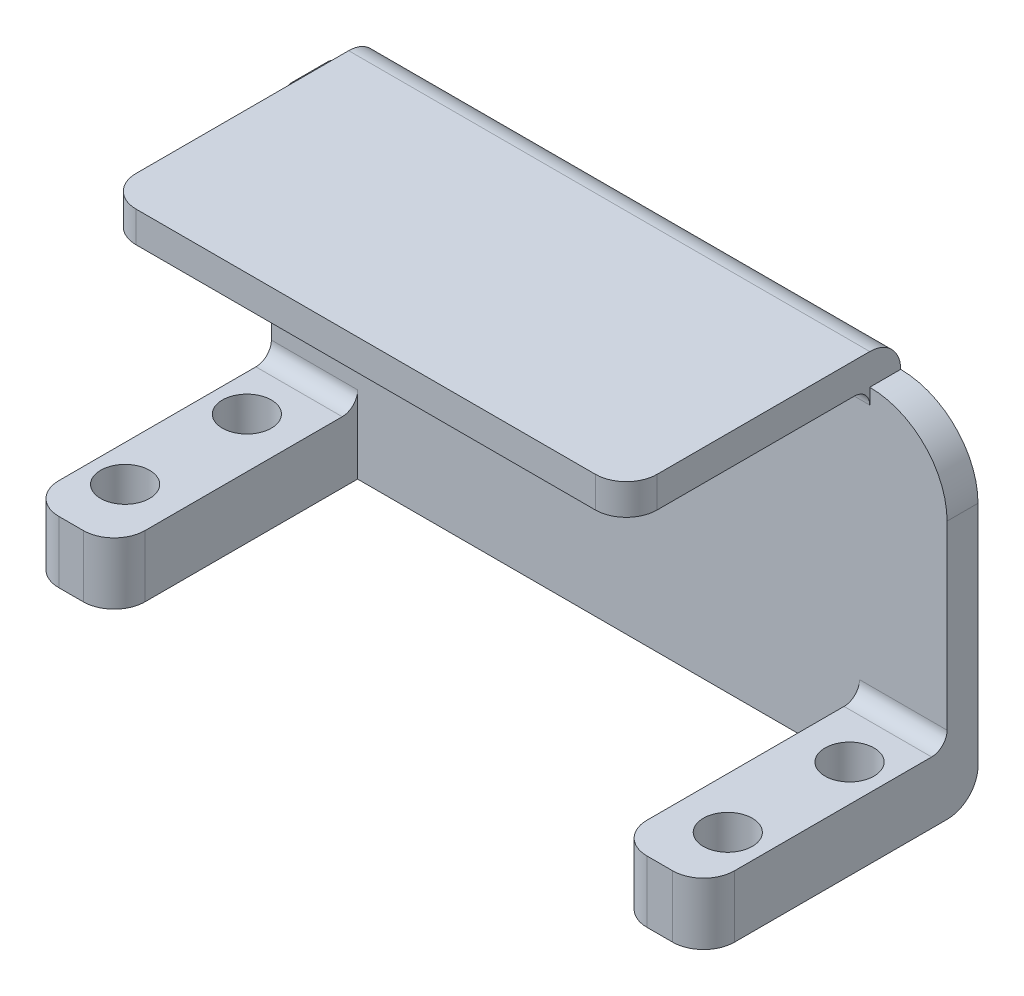
ISO-10303-21;
HEADER;
FILE_DESCRIPTION(('STEP AP214'),'2;1');
FILE_NAME('part.step','',(''),(''),'','','');
FILE_SCHEMA(('AUTOMOTIVE_DESIGN { 1 0 10303 214 1 1 1 1 }'));
ENDSEC;
DATA;
#1=APPLICATION_CONTEXT('core data for automotive mechanical design processes');
#2=APPLICATION_PROTOCOL_DEFINITION('international standard','automotive_design',2000,#1);
#3=PRODUCT_CONTEXT('',#1,'mechanical');
#4=PRODUCT('Part','Part','',(#3));
#5=PRODUCT_RELATED_PRODUCT_CATEGORY('part','',(#4));
#6=PRODUCT_DEFINITION_FORMATION('','',#4);
#7=PRODUCT_DEFINITION_CONTEXT('part definition',#1,'design');
#8=PRODUCT_DEFINITION('design','',#6,#7);
#9=PRODUCT_DEFINITION_SHAPE('','',#8);
#10=(LENGTH_UNIT() NAMED_UNIT(*) SI_UNIT(.MILLI.,.METRE.));
#11=(NAMED_UNIT(*) PLANE_ANGLE_UNIT() SI_UNIT($,.RADIAN.));
#12=(NAMED_UNIT(*) SI_UNIT($,.STERADIAN.) SOLID_ANGLE_UNIT());
#13=UNCERTAINTY_MEASURE_WITH_UNIT(LENGTH_MEASURE(1.E-05),#10,'distance_accuracy_value','');
#14=(GEOMETRIC_REPRESENTATION_CONTEXT(3) GLOBAL_UNCERTAINTY_ASSIGNED_CONTEXT((#13)) GLOBAL_UNIT_ASSIGNED_CONTEXT((#10,
#11,#12)) REPRESENTATION_CONTEXT('',''));
#15=CARTESIAN_POINT('',(0.,0.,0.));
#16=DIRECTION('',(0.,0.,1.));
#17=DIRECTION('',(1.,0.,0.));
#18=AXIS2_PLACEMENT_3D('',#15,#16,#17);
#19=CARTESIAN_POINT('',(0.,0.,0.));
#20=DIRECTION('',(0.,0.,1.));
#21=DIRECTION('',(1.,0.,0.));
#22=AXIS2_PLACEMENT_3D('',#19,#20,#21);
#23=PLANE('',#22);
#24=DIRECTION('',(0.,-1.,0.));
#25=VECTOR('',#24,1.);
#26=CARTESIAN_POINT('',(18.0906530612245,0.,0.));
#27=LINE('',#26,#25);
#28=CARTESIAN_POINT('',(18.0906530612245,-6.66374149659865,0.));
#29=VERTEX_POINT('',#28);
#30=CARTESIAN_POINT('',(18.0906530612245,-13.0137414965986,0.));
#31=VERTEX_POINT('',#30);
#32=EDGE_CURVE('E388',#29,#31,#27,.T.);
#33=ORIENTED_EDGE('',*,*,#32,.F.);
#34=DIRECTION('',(-1.,0.,0.));
#35=VECTOR('',#34,1.);
#36=CARTESIAN_POINT('',(0.,-6.66374149659866,0.));
#37=LINE('',#36,#35);
#38=CARTESIAN_POINT('',(25.2826530612245,-6.66374149659865,0.));
#39=VERTEX_POINT('',#38);
#40=EDGE_CURVE('E350',#29,#39,#37,.F.);
#41=ORIENTED_EDGE('',*,*,#40,.T.);
#42=DIRECTION('',(0.,1.,0.));
#43=VECTOR('',#42,1.);
#44=CARTESIAN_POINT('',(25.2826530612245,0.,0.));
#45=LINE('',#44,#43);
#46=CARTESIAN_POINT('',(25.2826530612245,8.20625850340137,0.));
#47=VERTEX_POINT('',#46);
#48=EDGE_CURVE('E252',#39,#47,#45,.T.);
#49=ORIENTED_EDGE('',*,*,#48,.T.);
#50=CARTESIAN_POINT('',(18.9326530612245,8.20625850340137,0.));
#51=DIRECTION('',(0.,0.,1.));
#52=DIRECTION('',(1.,0.,0.));
#53=AXIS2_PLACEMENT_3D('',#50,#51,#52);
#54=CIRCLE('',#53,6.35);
#55=CARTESIAN_POINT('',(18.9326530612245,14.5562585034014,0.));
#56=VERTEX_POINT('',#55);
#57=EDGE_CURVE('E254',#47,#56,#54,.T.);
#58=ORIENTED_EDGE('',*,*,#57,.T.);
#59=DIRECTION('',(0.,-1.,0.));
#60=VECTOR('',#59,1.);
#61=CARTESIAN_POINT('',(18.9326530612245,0.,0.));
#62=LINE('',#61,#60);
#63=CARTESIAN_POINT('',(18.9326530612245,13.2862585034014,0.));
#64=VERTEX_POINT('',#63);
#65=EDGE_CURVE('E56',#56,#64,#62,.T.);
#66=ORIENTED_EDGE('',*,*,#65,.T.);
#67=DIRECTION('',(1.,0.,0.));
#68=VECTOR('',#67,1.);
#69=CARTESIAN_POINT('',(0.,13.2862585034014,0.));
#70=LINE('',#69,#68);
#71=CARTESIAN_POINT('',(-23.8673469387755,13.2862585034014,0.));
#72=VERTEX_POINT('',#71);
#73=EDGE_CURVE('E220',#64,#72,#70,.F.);
#74=ORIENTED_EDGE('',*,*,#73,.T.);
#75=DIRECTION('',(0.,1.,0.));
#76=VECTOR('',#75,1.);
#77=CARTESIAN_POINT('',(-23.8673469387755,0.,0.));
#78=LINE('',#77,#76);
#79=CARTESIAN_POINT('',(-23.8673469387755,14.5562585034014,0.));
#80=VERTEX_POINT('',#79);
#81=EDGE_CURVE('E214',#72,#80,#78,.T.);
#82=ORIENTED_EDGE('',*,*,#81,.T.);
#83=CARTESIAN_POINT('',(-23.8673469387755,8.20625850340136,0.));
#84=DIRECTION('',(0.,0.,1.));
#85=DIRECTION('',(1.,0.,0.));
#86=AXIS2_PLACEMENT_3D('',#83,#84,#85);
#87=CIRCLE('',#86,6.35);
#88=CARTESIAN_POINT('',(-30.2173469387755,8.20625850340136,0.));
#89=VERTEX_POINT('',#88);
#90=EDGE_CURVE('E218',#80,#89,#87,.T.);
#91=ORIENTED_EDGE('',*,*,#90,.T.);
#92=DIRECTION('',(0.,1.,0.));
#93=VECTOR('',#92,1.);
#94=CARTESIAN_POINT('',(-30.2173469387755,0.,0.));
#95=LINE('',#94,#93);
#96=CARTESIAN_POINT('',(-30.2173469387755,-6.66374149659866,0.));
#97=VERTEX_POINT('',#96);
#98=EDGE_CURVE('E238',#97,#89,#95,.T.);
#99=ORIENTED_EDGE('',*,*,#98,.F.);
#100=DIRECTION('',(1.,0.,0.));
#101=VECTOR('',#100,1.);
#102=CARTESIAN_POINT('',(-23.1253469387755,-6.66374149659866,0.));
#103=LINE('',#102,#101);
#104=CARTESIAN_POINT('',(-23.1253469387755,-6.66374149659866,0.));
#105=VERTEX_POINT('',#104);
#106=EDGE_CURVE('E347',#97,#105,#103,.T.);
#107=ORIENTED_EDGE('',*,*,#106,.T.);
#108=DIRECTION('',(0.,-1.,0.));
#109=VECTOR('',#108,1.);
#110=CARTESIAN_POINT('',(-23.1253469387755,0.,0.));
#111=LINE('',#110,#109);
#112=CARTESIAN_POINT('',(-23.1253469387755,-13.0037414965987,0.));
#113=VERTEX_POINT('',#112);
#114=EDGE_CURVE('E418',#105,#113,#111,.T.);
#115=ORIENTED_EDGE('',*,*,#114,.T.);
#116=DIRECTION('',(-0.999999005895813,-0.00141003807937902,0.));
#117=VECTOR('',#116,1.);
#118=CARTESIAN_POINT('',(0.0182897744713675,-12.9711080550966,0.));
#119=LINE('',#118,#117);
#120=CARTESIAN_POINT('',(-30.2173469387755,-13.0137414965987,0.));
#121=VERTEX_POINT('',#120);
#122=EDGE_CURVE('E403',#113,#121,#119,.T.);
#123=ORIENTED_EDGE('',*,*,#122,.T.);
#124=DIRECTION('',(-1.,0.,0.));
#125=VECTOR('',#124,1.);
#126=CARTESIAN_POINT('',(0.,-13.0137414965987,0.));
#127=LINE('',#126,#125);
#128=EDGE_CURVE('E241',#31,#121,#127,.T.);
#129=ORIENTED_EDGE('',*,*,#128,.F.);
#130=EDGE_LOOP('',(#33,#41,#49,#58,#66,#74,#82,#91,#99,#107,#115,#123,#129));
#131=FACE_BOUND('',#130,.T.);
#132=ADVANCED_FACE('F39',(#131),#23,.T.);
#133=CARTESIAN_POINT('',(18.9326530612245,0.,-2.54));
#134=DIRECTION('',(-1.,0.,0.));
#135=DIRECTION('',(0.,0.,1.));
#136=AXIS2_PLACEMENT_3D('',#133,#134,#135);
#137=PLANE('',#136);
#138=DIRECTION('',(0.,0.,1.));
#139=VECTOR('',#138,1.);
#140=CARTESIAN_POINT('',(18.9326530612245,14.5562585034014,-2.54));
#141=LINE('',#140,#139);
#142=CARTESIAN_POINT('',(18.9326530612245,14.5562585034014,-2.54));
#143=VERTEX_POINT('',#142);
#144=EDGE_CURVE('E257',#143,#56,#141,.T.);
#145=ORIENTED_EDGE('',*,*,#144,.F.);
#146=CARTESIAN_POINT('',(18.9326530612245,14.5562585034014,0.));
#147=DIRECTION('',(-1.,0.,0.));
#148=DIRECTION('',(0.,0.,1.));
#149=AXIS2_PLACEMENT_3D('',#146,#147,#148);
#150=CIRCLE('',#149,2.54);
#151=CARTESIAN_POINT('',(18.9326530612245,17.0962585034014,0.));
#152=VERTEX_POINT('',#151);
#153=EDGE_CURVE('E281',#143,#152,#150,.F.);
#154=ORIENTED_EDGE('',*,*,#153,.T.);
#155=DIRECTION('',(0.,0.,1.));
#156=VECTOR('',#155,1.);
#157=CARTESIAN_POINT('',(18.9326530612245,17.0962585034014,-2.54));
#158=LINE('',#157,#156);
#159=CARTESIAN_POINT('',(18.9326530612245,17.0962585034014,17.46));
#160=VERTEX_POINT('',#159);
#161=EDGE_CURVE('E270',#152,#160,#158,.T.);
#162=ORIENTED_EDGE('',*,*,#161,.T.);
#163=DIRECTION('',(0.,-1.,0.));
#164=VECTOR('',#163,1.);
#165=CARTESIAN_POINT('',(18.9326530612245,0.,17.46));
#166=LINE('',#165,#164);
#167=CARTESIAN_POINT('',(18.9326530612245,14.5562585034014,17.46));
#168=VERTEX_POINT('',#167);
#169=EDGE_CURVE('E278',#160,#168,#166,.T.);
#170=ORIENTED_EDGE('',*,*,#169,.T.);
#171=DIRECTION('',(0.,0.,-1.));
#172=VECTOR('',#171,1.);
#173=CARTESIAN_POINT('',(18.9326530612245,14.5562585034014,62.8753029143819));
#174=LINE('',#173,#172);
#175=CARTESIAN_POINT('',(18.9326530612245,14.5562585034014,1.27));
#176=VERTEX_POINT('',#175);
#177=EDGE_CURVE('E372',#168,#176,#174,.T.);
#178=ORIENTED_EDGE('',*,*,#177,.T.);
#179=CARTESIAN_POINT('',(18.9326530612245,13.2862585034014,1.27));
#180=DIRECTION('',(-1.,0.,0.));
#181=DIRECTION('',(0.,0.,1.));
#182=AXIS2_PLACEMENT_3D('',#179,#180,#181);
#183=CIRCLE('',#182,1.27);
#184=EDGE_CURVE('E48',#176,#64,#183,.T.);
#185=ORIENTED_EDGE('',*,*,#184,.T.);
#186=ORIENTED_EDGE('',*,*,#65,.F.);
#187=EDGE_LOOP('',(#145,#154,#162,#170,#178,#185,#186));
#188=FACE_BOUND('',#187,.T.);
#189=ADVANCED_FACE('F447',(#188),#137,.F.);
#190=CARTESIAN_POINT('',(18.9326530612245,8.20625850340137,-2.54));
#191=DIRECTION('',(0.,0.,1.));
#192=DIRECTION('',(1.,0.,0.));
#193=AXIS2_PLACEMENT_3D('',#190,#191,#192);
#194=CYLINDRICAL_SURFACE('',#193,6.35);
#195=ORIENTED_EDGE('',*,*,#57,.F.);
#196=DIRECTION('',(0.,0.,1.));
#197=VECTOR('',#196,1.);
#198=CARTESIAN_POINT('',(25.2826530612245,8.20625850340137,-2.54));
#199=LINE('',#198,#197);
#200=CARTESIAN_POINT('',(25.2826530612245,8.20625850340137,-2.54));
#201=VERTEX_POINT('',#200);
#202=EDGE_CURVE('E261',#201,#47,#199,.T.);
#203=ORIENTED_EDGE('',*,*,#202,.F.);
#204=CARTESIAN_POINT('',(18.9326530612245,8.20625850340137,-2.54));
#205=DIRECTION('',(0.,0.,1.));
#206=DIRECTION('',(1.,0.,0.));
#207=AXIS2_PLACEMENT_3D('',#204,#205,#206);
#208=CIRCLE('',#207,6.35);
#209=EDGE_CURVE('E247',#201,#143,#208,.T.);
#210=ORIENTED_EDGE('',*,*,#209,.T.);
#211=ORIENTED_EDGE('',*,*,#144,.T.);
#212=EDGE_LOOP('',(#195,#203,#210,#211));
#213=FACE_BOUND('',#212,.T.);
#214=ADVANCED_FACE('F441',(#213),#194,.T.);
#215=CARTESIAN_POINT('',(25.2826530612245,0.,-2.54));
#216=DIRECTION('',(1.,0.,0.));
#217=DIRECTION('',(0.,1.,0.));
#218=AXIS2_PLACEMENT_3D('',#215,#216,#217);
#219=PLANE('',#218);
#220=DIRECTION('',(0.,0.,1.));
#221=VECTOR('',#220,1.);
#222=CARTESIAN_POINT('',(25.2826530612245,-13.0137414965986,-2.54));
#223=LINE('',#222,#221);
#224=CARTESIAN_POINT('',(25.2826530612245,-13.0137414965986,0.));
#225=VERTEX_POINT('',#224);
#226=CARTESIAN_POINT('',(25.2826530612245,-13.0137414965986,17.46));
#227=VERTEX_POINT('',#226);
#228=EDGE_CURVE('E264',#225,#227,#223,.T.);
#229=ORIENTED_EDGE('',*,*,#228,.F.);
#230=CARTESIAN_POINT('',(25.2826530612245,-10.4737414965986,0.));
#231=DIRECTION('',(1.,0.,0.));
#232=DIRECTION('',(0.,1.,0.));
#233=AXIS2_PLACEMENT_3D('',#230,#231,#232);
#234=CIRCLE('',#233,2.54);
#235=CARTESIAN_POINT('',(25.2826530612245,-10.4737414965986,-2.54));
#236=VERTEX_POINT('',#235);
#237=EDGE_CURVE('E315',#225,#236,#234,.T.);
#238=ORIENTED_EDGE('',*,*,#237,.T.);
#239=DIRECTION('',(0.,1.,0.));
#240=VECTOR('',#239,1.);
#241=CARTESIAN_POINT('',(25.2826530612245,0.,-2.54));
#242=LINE('',#241,#240);
#243=EDGE_CURVE('E433',#236,#201,#242,.T.);
#244=ORIENTED_EDGE('',*,*,#243,.T.);
#245=ORIENTED_EDGE('',*,*,#202,.T.);
#246=ORIENTED_EDGE('',*,*,#48,.F.);
#247=CARTESIAN_POINT('',(25.2826530612245,-6.66374149659865,1.27));
#248=DIRECTION('',(1.,0.,0.));
#249=DIRECTION('',(0.,1.,0.));
#250=AXIS2_PLACEMENT_3D('',#247,#248,#249);
#251=CIRCLE('',#250,1.27);
#252=CARTESIAN_POINT('',(25.2826530612245,-7.93374149659865,1.27));
#253=VERTEX_POINT('',#252);
#254=EDGE_CURVE('E360',#39,#253,#251,.F.);
#255=ORIENTED_EDGE('',*,*,#254,.T.);
#256=DIRECTION('',(0.,0.,-1.));
#257=VECTOR('',#256,1.);
#258=CARTESIAN_POINT('',(25.2826530612245,-7.93374149659865,62.8753029143819));
#259=LINE('',#258,#257);
#260=CARTESIAN_POINT('',(25.2826530612245,-7.93374149659865,17.46));
#261=VERTEX_POINT('',#260);
#262=EDGE_CURVE('E406',#261,#253,#259,.T.);
#263=ORIENTED_EDGE('',*,*,#262,.F.);
#264=DIRECTION('',(0.,-1.,0.));
#265=VECTOR('',#264,1.);
#266=CARTESIAN_POINT('',(25.2826530612245,-13.0137414965986,17.46));
#267=LINE('',#266,#265);
#268=EDGE_CURVE('E312',#261,#227,#267,.T.);
#269=ORIENTED_EDGE('',*,*,#268,.T.);
#270=EDGE_LOOP('',(#229,#238,#244,#245,#246,#255,#263,#269));
#271=FACE_BOUND('',#270,.T.);
#272=ADVANCED_FACE('F480',(#271),#219,.T.);
#273=CARTESIAN_POINT('',(0.,-13.0137414965987,-2.54));
#274=DIRECTION('',(0.,1.,0.));
#275=DIRECTION('',(-1.,0.,0.));
#276=AXIS2_PLACEMENT_3D('',#273,#274,#275);
#277=PLANE('',#276);
#278=CARTESIAN_POINT('',(22.278437043176,-13.0137414965986,15.));
#279=DIRECTION('',(0.,1.,0.));
#280=DIRECTION('',(-1.,0.,0.));
#281=AXIS2_PLACEMENT_3D('',#278,#279,#280);
#282=ELLIPSE('',#281,2.0100019981514,2.01);
#283=CARTESIAN_POINT('',(20.2684350450246,-13.0137414965986,15.));
#284=VERTEX_POINT('',#283);
#285=EDGE_CURVE('E617',#284,#284,#282,.T.);
#286=ORIENTED_EDGE('',*,*,#285,.T.);
#287=EDGE_LOOP('',(#286));
#288=FACE_BOUND('',#287,.T.);
#289=CARTESIAN_POINT('',(22.278437043176,-13.0137414965986,5.));
#290=DIRECTION('',(0.,1.,0.));
#291=DIRECTION('',(-1.,0.,0.));
#292=AXIS2_PLACEMENT_3D('',#289,#290,#291);
#293=ELLIPSE('',#292,2.01000199815141,2.01);
#294=CARTESIAN_POINT('',(20.2684350450246,-13.0137414965986,5.));
#295=VERTEX_POINT('',#294);
#296=EDGE_CURVE('E374',#295,#295,#293,.T.);
#297=ORIENTED_EDGE('',*,*,#296,.T.);
#298=EDGE_LOOP('',(#297));
#299=FACE_BOUND('',#298,.T.);
#300=DIRECTION('',(0.,0.,-1.));
#301=VECTOR('',#300,1.);
#302=CARTESIAN_POINT('',(18.0906530612245,-13.0137414965986,62.8753029143819));
#303=LINE('',#302,#301);
#304=CARTESIAN_POINT('',(18.0906530612245,-13.0137414965986,17.46));
#305=VERTEX_POINT('',#304);
#306=EDGE_CURVE('E409',#305,#31,#303,.T.);
#307=ORIENTED_EDGE('',*,*,#306,.T.);
#308=DIRECTION('',(-1.,0.,0.));
#309=VECTOR('',#308,1.);
#310=CARTESIAN_POINT('',(0.,-13.0137414965987,0.));
#311=LINE('',#310,#309);
#312=EDGE_CURVE('E310',#31,#225,#311,.F.);
#313=ORIENTED_EDGE('',*,*,#312,.T.);
#314=ORIENTED_EDGE('',*,*,#228,.T.);
#315=CARTESIAN_POINT('',(22.7426530612245,-13.0137414965986,17.46));
#316=DIRECTION('',(0.,1.,0.));
#317=DIRECTION('',(-1.,0.,0.));
#318=AXIS2_PLACEMENT_3D('',#315,#316,#317);
#319=CIRCLE('',#318,2.54);
#320=CARTESIAN_POINT('',(22.7426530612245,-13.0137414965986,20.));
#321=VERTEX_POINT('',#320);
#322=EDGE_CURVE('E306',#227,#321,#319,.F.);
#323=ORIENTED_EDGE('',*,*,#322,.T.);
#324=DIRECTION('',(-1.,0.,0.));
#325=VECTOR('',#324,1.);
#326=CARTESIAN_POINT('',(0.,-13.0137414965987,20.));
#327=LINE('',#326,#325);
#328=CARTESIAN_POINT('',(20.6306530612245,-13.0137414965986,20.));
#329=VERTEX_POINT('',#328);
#330=EDGE_CURVE('E396',#321,#329,#327,.T.);
#331=ORIENTED_EDGE('',*,*,#330,.T.);
#332=CARTESIAN_POINT('',(20.6306530612245,-13.0137414965986,17.46));
#333=DIRECTION('',(0.,1.,0.));
#334=DIRECTION('',(-1.,0.,0.));
#335=AXIS2_PLACEMENT_3D('',#332,#333,#334);
#336=CIRCLE('',#335,2.54);
#337=EDGE_CURVE('E308',#329,#305,#336,.F.);
#338=ORIENTED_EDGE('',*,*,#337,.T.);
#339=EDGE_LOOP('',(#307,#313,#314,#323,#331,#338));
#340=FACE_BOUND('',#339,.T.);
#341=ADVANCED_FACE('F483',(#288,#299,#340),#277,.F.);
#342=CARTESIAN_POINT('',(-30.2173469387755,0.,-2.54));
#343=DIRECTION('',(1.,0.,0.));
#344=DIRECTION('',(0.,1.,0.));
#345=AXIS2_PLACEMENT_3D('',#342,#343,#344);
#346=PLANE('',#345);
#347=DIRECTION('',(0.,1.,0.));
#348=VECTOR('',#347,1.);
#349=CARTESIAN_POINT('',(-30.2173469387755,0.,-2.54));
#350=LINE('',#349,#348);
#351=CARTESIAN_POINT('',(-30.2173469387755,-10.4737414965987,-2.54));
#352=VERTEX_POINT('',#351);
#353=CARTESIAN_POINT('',(-30.2173469387755,8.20625850340136,-2.54));
#354=VERTEX_POINT('',#353);
#355=EDGE_CURVE('E432',#352,#354,#350,.T.);
#356=ORIENTED_EDGE('',*,*,#355,.F.);
#357=CARTESIAN_POINT('',(-30.2173469387755,-10.4737414965987,0.));
#358=DIRECTION('',(1.,0.,0.));
#359=DIRECTION('',(0.,1.,0.));
#360=AXIS2_PLACEMENT_3D('',#357,#358,#359);
#361=CIRCLE('',#360,2.54);
#362=EDGE_CURVE('E304',#352,#121,#361,.F.);
#363=ORIENTED_EDGE('',*,*,#362,.T.);
#364=DIRECTION('',(0.,0.,-1.));
#365=VECTOR('',#364,1.);
#366=CARTESIAN_POINT('',(-30.2173469387755,-13.0137414965987,62.8753029143819));
#367=LINE('',#366,#365);
#368=CARTESIAN_POINT('',(-30.2173469387755,-13.0137414965987,17.46));
#369=VERTEX_POINT('',#368);
#370=EDGE_CURVE('E421',#369,#121,#367,.T.);
#371=ORIENTED_EDGE('',*,*,#370,.F.);
#372=DIRECTION('',(0.,1.,0.));
#373=VECTOR('',#372,1.);
#374=CARTESIAN_POINT('',(-30.2173469387755,0.,17.46));
#375=LINE('',#374,#373);
#376=CARTESIAN_POINT('',(-30.2173469387755,-7.93374149659866,17.46));
#377=VERTEX_POINT('',#376);
#378=EDGE_CURVE('E301',#369,#377,#375,.T.);
#379=ORIENTED_EDGE('',*,*,#378,.T.);
#380=DIRECTION('',(0.,0.,-1.));
#381=VECTOR('',#380,1.);
#382=CARTESIAN_POINT('',(-30.2173469387755,-7.93374149659866,62.8753029143819));
#383=LINE('',#382,#381);
#384=CARTESIAN_POINT('',(-30.2173469387755,-7.93374149659866,1.27));
#385=VERTEX_POINT('',#384);
#386=EDGE_CURVE('E424',#377,#385,#383,.T.);
#387=ORIENTED_EDGE('',*,*,#386,.T.);
#388=CARTESIAN_POINT('',(-30.2173469387755,-6.66374149659866,1.27));
#389=DIRECTION('',(1.,0.,0.));
#390=DIRECTION('',(0.,1.,0.));
#391=AXIS2_PLACEMENT_3D('',#388,#389,#390);
#392=CIRCLE('',#391,1.27);
#393=EDGE_CURVE('E364',#385,#97,#392,.T.);
#394=ORIENTED_EDGE('',*,*,#393,.T.);
#395=ORIENTED_EDGE('',*,*,#98,.T.);
#396=DIRECTION('',(0.,0.,1.));
#397=VECTOR('',#396,1.);
#398=CARTESIAN_POINT('',(-30.2173469387755,8.20625850340136,-2.54));
#399=LINE('',#398,#397);
#400=EDGE_CURVE('E232',#354,#89,#399,.T.);
#401=ORIENTED_EDGE('',*,*,#400,.F.);
#402=EDGE_LOOP('',(#356,#363,#371,#379,#387,#394,#395,#401));
#403=FACE_BOUND('',#402,.T.);
#404=ADVANCED_FACE('F486',(#403),#346,.F.);
#405=CARTESIAN_POINT('',(-23.8673469387755,8.20625850340136,-2.54));
#406=DIRECTION('',(0.,0.,1.));
#407=DIRECTION('',(1.,0.,0.));
#408=AXIS2_PLACEMENT_3D('',#405,#406,#407);
#409=CYLINDRICAL_SURFACE('',#408,6.35);
#410=ORIENTED_EDGE('',*,*,#90,.F.);
#411=DIRECTION('',(0.,0.,1.));
#412=VECTOR('',#411,1.);
#413=CARTESIAN_POINT('',(-23.8673469387755,14.5562585034014,-2.54));
#414=LINE('',#413,#412);
#415=CARTESIAN_POINT('',(-23.8673469387755,14.5562585034014,-2.54));
#416=VERTEX_POINT('',#415);
#417=EDGE_CURVE('E224',#416,#80,#414,.T.);
#418=ORIENTED_EDGE('',*,*,#417,.F.);
#419=CARTESIAN_POINT('',(-23.8673469387755,8.20625850340136,-2.54));
#420=DIRECTION('',(0.,0.,1.));
#421=DIRECTION('',(1.,0.,0.));
#422=AXIS2_PLACEMENT_3D('',#419,#420,#421);
#423=CIRCLE('',#422,6.35);
#424=EDGE_CURVE('E256',#416,#354,#423,.T.);
#425=ORIENTED_EDGE('',*,*,#424,.T.);
#426=ORIENTED_EDGE('',*,*,#400,.T.);
#427=EDGE_LOOP('',(#410,#418,#425,#426));
#428=FACE_BOUND('',#427,.T.);
#429=ADVANCED_FACE('F236',(#428),#409,.T.);
#430=CARTESIAN_POINT('',(-23.8673469387755,0.,-2.54));
#431=DIRECTION('',(1.,0.,0.));
#432=DIRECTION('',(0.,0.,-1.));
#433=AXIS2_PLACEMENT_3D('',#430,#431,#432);
#434=PLANE('',#433);
#435=DIRECTION('',(0.,0.,1.));
#436=VECTOR('',#435,1.);
#437=CARTESIAN_POINT('',(-23.8673469387755,17.0962585034014,-2.54));
#438=LINE('',#437,#436);
#439=CARTESIAN_POINT('',(-23.8673469387755,17.0962585034014,0.));
#440=VERTEX_POINT('',#439);
#441=CARTESIAN_POINT('',(-23.8673469387755,17.0962585034014,17.46));
#442=VERTEX_POINT('',#441);
#443=EDGE_CURVE('E233',#440,#442,#438,.T.);
#444=ORIENTED_EDGE('',*,*,#443,.F.);
#445=CARTESIAN_POINT('',(-23.8673469387755,14.5562585034014,0.));
#446=DIRECTION('',(1.,0.,0.));
#447=DIRECTION('',(0.,0.,-1.));
#448=AXIS2_PLACEMENT_3D('',#445,#446,#447);
#449=CIRCLE('',#448,2.54);
#450=EDGE_CURVE('E228',#440,#416,#449,.F.);
#451=ORIENTED_EDGE('',*,*,#450,.T.);
#452=ORIENTED_EDGE('',*,*,#417,.T.);
#453=ORIENTED_EDGE('',*,*,#81,.F.);
#454=CARTESIAN_POINT('',(-23.8673469387755,13.2862585034014,1.27));
#455=DIRECTION('',(1.,0.,0.));
#456=DIRECTION('',(0.,0.,-1.));
#457=AXIS2_PLACEMENT_3D('',#454,#455,#456);
#458=CIRCLE('',#457,1.27);
#459=CARTESIAN_POINT('',(-23.8673469387755,14.5562585034014,1.27));
#460=VERTEX_POINT('',#459);
#461=EDGE_CURVE('E11',#72,#460,#458,.T.);
#462=ORIENTED_EDGE('',*,*,#461,.T.);
#463=DIRECTION('',(0.,0.,-1.));
#464=VECTOR('',#463,1.);
#465=CARTESIAN_POINT('',(-23.8673469387755,14.5562585034014,62.8753029143819));
#466=LINE('',#465,#464);
#467=CARTESIAN_POINT('',(-23.8673469387755,14.5562585034014,17.46));
#468=VERTEX_POINT('',#467);
#469=EDGE_CURVE('E392',#468,#460,#466,.T.);
#470=ORIENTED_EDGE('',*,*,#469,.F.);
#471=DIRECTION('',(0.,1.,0.));
#472=VECTOR('',#471,1.);
#473=CARTESIAN_POINT('',(-23.8673469387755,0.,17.46));
#474=LINE('',#473,#472);
#475=EDGE_CURVE('E289',#468,#442,#474,.T.);
#476=ORIENTED_EDGE('',*,*,#475,.T.);
#477=EDGE_LOOP('',(#444,#451,#452,#453,#462,#470,#476));
#478=FACE_BOUND('',#477,.T.);
#479=ADVANCED_FACE('F226',(#478),#434,.F.);
#480=CARTESIAN_POINT('',(0.,17.0962585034014,-2.54));
#481=DIRECTION('',(0.,-1.,0.));
#482=DIRECTION('',(1.,0.,0.));
#483=AXIS2_PLACEMENT_3D('',#480,#481,#482);
#484=PLANE('',#483);
#485=ORIENTED_EDGE('',*,*,#161,.F.);
#486=DIRECTION('',(1.,0.,0.));
#487=VECTOR('',#486,1.);
#488=CARTESIAN_POINT('',(0.,17.0962585034014,0.));
#489=LINE('',#488,#487);
#490=EDGE_CURVE('E287',#152,#440,#489,.F.);
#491=ORIENTED_EDGE('',*,*,#490,.T.);
#492=ORIENTED_EDGE('',*,*,#443,.T.);
#493=CARTESIAN_POINT('',(-21.3273469387755,17.0962585034014,17.46));
#494=DIRECTION('',(0.,-1.,0.));
#495=DIRECTION('',(1.,0.,0.));
#496=AXIS2_PLACEMENT_3D('',#493,#494,#495);
#497=CIRCLE('',#496,2.54);
#498=CARTESIAN_POINT('',(-21.3273469387755,17.0962585034014,20.));
#499=VERTEX_POINT('',#498);
#500=EDGE_CURVE('E283',#442,#499,#497,.F.);
#501=ORIENTED_EDGE('',*,*,#500,.T.);
#502=DIRECTION('',(1.,0.,0.));
#503=VECTOR('',#502,1.);
#504=CARTESIAN_POINT('',(0.,17.0962585034014,20.));
#505=LINE('',#504,#503);
#506=CARTESIAN_POINT('',(16.3926530612245,17.0962585034014,20.));
#507=VERTEX_POINT('',#506);
#508=EDGE_CURVE('E389',#499,#507,#505,.T.);
#509=ORIENTED_EDGE('',*,*,#508,.T.);
#510=CARTESIAN_POINT('',(16.3926530612245,17.0962585034014,17.46));
#511=DIRECTION('',(0.,-1.,0.));
#512=DIRECTION('',(1.,0.,0.));
#513=AXIS2_PLACEMENT_3D('',#510,#511,#512);
#514=CIRCLE('',#513,2.54);
#515=EDGE_CURVE('E285',#507,#160,#514,.F.);
#516=ORIENTED_EDGE('',*,*,#515,.T.);
#517=EDGE_LOOP('',(#485,#491,#492,#501,#509,#516));
#518=FACE_BOUND('',#517,.T.);
#519=ADVANCED_FACE('F452',(#518),#484,.F.);
#520=CARTESIAN_POINT('',(0.,0.,-2.54));
#521=DIRECTION('',(0.,0.,1.));
#522=DIRECTION('',(1.,0.,0.));
#523=AXIS2_PLACEMENT_3D('',#520,#521,#522);
#524=PLANE('',#523);
#525=ORIENTED_EDGE('',*,*,#424,.F.);
#526=DIRECTION('',(1.,0.,0.));
#527=VECTOR('',#526,1.);
#528=CARTESIAN_POINT('',(0.,14.5562585034014,-2.54));
#529=LINE('',#528,#527);
#530=EDGE_CURVE('E275',#416,#143,#529,.T.);
#531=ORIENTED_EDGE('',*,*,#530,.T.);
#532=ORIENTED_EDGE('',*,*,#209,.F.);
#533=ORIENTED_EDGE('',*,*,#243,.F.);
#534=DIRECTION('',(-1.,0.,0.));
#535=VECTOR('',#534,1.);
#536=CARTESIAN_POINT('',(0.,-10.4737414965987,-2.54));
#537=LINE('',#536,#535);
#538=EDGE_CURVE('E260',#236,#352,#537,.T.);
#539=ORIENTED_EDGE('',*,*,#538,.T.);
#540=ORIENTED_EDGE('',*,*,#355,.T.);
#541=EDGE_LOOP('',(#525,#531,#532,#533,#539,#540));
#542=FACE_BOUND('',#541,.T.);
#543=ADVANCED_FACE('F443',(#542),#524,.F.);
#544=CARTESIAN_POINT('',(0.,-7.93374149659866,62.8753029143819));
#545=DIRECTION('',(0.,1.,0.));
#546=DIRECTION('',(0.,0.,1.));
#547=AXIS2_PLACEMENT_3D('',#544,#545,#546);
#548=PLANE('',#547);
#549=CARTESIAN_POINT('',(-27.228725957388,-7.93374149659866,15.));
#550=DIRECTION('',(0.,1.,0.));
#551=DIRECTION('',(1.,0.,0.));
#552=AXIS2_PLACEMENT_3D('',#549,#550,#551);
#553=ELLIPSE('',#552,2.01000199815141,2.01);
#554=CARTESIAN_POINT('',(-25.2187239592366,-7.93374149659866,15.));
#555=VERTEX_POINT('',#554);
#556=EDGE_CURVE('E383',#555,#555,#553,.F.);
#557=ORIENTED_EDGE('',*,*,#556,.T.);
#558=EDGE_LOOP('',(#557));
#559=FACE_BOUND('',#558,.T.);
#560=CARTESIAN_POINT('',(-27.228725957388,-7.93374149659866,5.));
#561=DIRECTION('',(0.,1.,0.));
#562=DIRECTION('',(1.,0.,0.));
#563=AXIS2_PLACEMENT_3D('',#560,#561,#562);
#564=ELLIPSE('',#563,2.01000199815141,2.01);
#565=CARTESIAN_POINT('',(-25.2187239592366,-7.93374149659866,5.));
#566=VERTEX_POINT('',#565);
#567=EDGE_CURVE('E368',#566,#566,#564,.F.);
#568=ORIENTED_EDGE('',*,*,#567,.T.);
#569=EDGE_LOOP('',(#568));
#570=FACE_BOUND('',#569,.T.);
#571=DIRECTION('',(0.,0.,-1.));
#572=VECTOR('',#571,1.);
#573=CARTESIAN_POINT('',(-23.1253469387755,-7.93374149659866,62.8753029143819));
#574=LINE('',#573,#572);
#575=CARTESIAN_POINT('',(-23.1253469387755,-7.93374149659866,17.46));
#576=VERTEX_POINT('',#575);
#577=CARTESIAN_POINT('',(-23.1253469387755,-7.93374149659866,1.27));
#578=VERTEX_POINT('',#577);
#579=EDGE_CURVE('E427',#576,#578,#574,.T.);
#580=ORIENTED_EDGE('',*,*,#579,.T.);
#581=DIRECTION('',(1.,0.,0.));
#582=VECTOR('',#581,1.);
#583=CARTESIAN_POINT('',(-30.2173469387755,-7.93374149659866,1.27));
#584=LINE('',#583,#582);
#585=EDGE_CURVE('E352',#578,#385,#584,.F.);
#586=ORIENTED_EDGE('',*,*,#585,.T.);
#587=ORIENTED_EDGE('',*,*,#386,.F.);
#588=CARTESIAN_POINT('',(-27.6773469387755,-7.93374149659866,17.46));
#589=DIRECTION('',(0.,1.,0.));
#590=DIRECTION('',(0.,0.,1.));
#591=AXIS2_PLACEMENT_3D('',#588,#589,#590);
#592=CIRCLE('',#591,2.54);
#593=CARTESIAN_POINT('',(-27.6773469387755,-7.93374149659866,20.));
#594=VERTEX_POINT('',#593);
#595=EDGE_CURVE('E333',#377,#594,#592,.T.);
#596=ORIENTED_EDGE('',*,*,#595,.T.);
#597=DIRECTION('',(-1.,0.,0.));
#598=VECTOR('',#597,1.);
#599=CARTESIAN_POINT('',(0.,-7.93374149659866,20.));
#600=LINE('',#599,#598);
#601=CARTESIAN_POINT('',(-25.6653469387755,-7.93374149659866,20.));
#602=VERTEX_POINT('',#601);
#603=EDGE_CURVE('E244',#602,#594,#600,.T.);
#604=ORIENTED_EDGE('',*,*,#603,.F.);
#605=CARTESIAN_POINT('',(-25.6653469387755,-7.93374149659866,17.46));
#606=DIRECTION('',(0.,1.,0.));
#607=DIRECTION('',(0.,0.,1.));
#608=AXIS2_PLACEMENT_3D('',#605,#606,#607);
#609=CIRCLE('',#608,2.54);
#610=EDGE_CURVE('E335',#602,#576,#609,.T.);
#611=ORIENTED_EDGE('',*,*,#610,.T.);
#612=EDGE_LOOP('',(#580,#586,#587,#596,#604,#611));
#613=FACE_BOUND('',#612,.T.);
#614=ADVANCED_FACE('F499',(#559,#570,#613),#548,.T.);
#615=CARTESIAN_POINT('',(-23.1253469387755,0.,62.8753029143819));
#616=DIRECTION('',(1.,0.,0.));
#617=DIRECTION('',(0.,0.,-1.));
#618=AXIS2_PLACEMENT_3D('',#615,#616,#617);
#619=PLANE('',#618);
#620=ORIENTED_EDGE('',*,*,#579,.F.);
#621=DIRECTION('',(0.,1.,0.));
#622=VECTOR('',#621,1.);
#623=CARTESIAN_POINT('',(-23.1253469387755,-13.0037414965987,17.46));
#624=LINE('',#623,#622);
#625=CARTESIAN_POINT('',(-23.1253469387755,-13.0037414965987,17.46));
#626=VERTEX_POINT('',#625);
#627=EDGE_CURVE('E337',#576,#626,#624,.F.);
#628=ORIENTED_EDGE('',*,*,#627,.T.);
#629=DIRECTION('',(0.,0.,-1.));
#630=VECTOR('',#629,1.);
#631=CARTESIAN_POINT('',(-23.1253469387755,-13.0037414965987,62.8753029143819));
#632=LINE('',#631,#630);
#633=EDGE_CURVE('E414',#626,#113,#632,.T.);
#634=ORIENTED_EDGE('',*,*,#633,.T.);
#635=ORIENTED_EDGE('',*,*,#114,.F.);
#636=CARTESIAN_POINT('',(-23.1253469387755,-6.66374149659866,1.27));
#637=DIRECTION('',(1.,0.,0.));
#638=DIRECTION('',(0.,0.,-1.));
#639=AXIS2_PLACEMENT_3D('',#636,#637,#638);
#640=CIRCLE('',#639,1.27);
#641=EDGE_CURVE('E362',#105,#578,#640,.F.);
#642=ORIENTED_EDGE('',*,*,#641,.T.);
#643=EDGE_LOOP('',(#620,#628,#634,#635,#642));
#644=FACE_BOUND('',#643,.T.);
#645=ADVANCED_FACE('F503',(#644),#619,.T.);
#646=CARTESIAN_POINT('',(0.0182897744713675,-12.9711080550966,62.8753029143819));
#647=DIRECTION('',(0.00141003807937902,-0.999999005895813,0.));
#648=DIRECTION('',(0.999999005895813,0.00141003807937902,0.));
#649=AXIS2_PLACEMENT_3D('',#646,#647,#648);
#650=PLANE('',#649);
#651=CARTESIAN_POINT('',(-27.2215689130639,-13.0095173313058,15.));
#652=DIRECTION('',(0.00141003807937902,-0.999999005895813,0.));
#653=DIRECTION('',(0.999999005895813,0.00141003807937902,0.));
#654=AXIS2_PLACEMENT_3D('',#651,#652,#653);
#655=CIRCLE('',#654,2.01);
#656=CARTESIAN_POINT('',(-25.2115709112133,-13.0066831547662,15.));
#657=VERTEX_POINT('',#656);
#658=EDGE_CURVE('E43',#657,#657,#655,.T.);
#659=ORIENTED_EDGE('',*,*,#658,.F.);
#660=EDGE_LOOP('',(#659));
#661=FACE_BOUND('',#660,.T.);
#662=CARTESIAN_POINT('',(-27.2215689130639,-13.0095173313058,5.));
#663=DIRECTION('',(0.00141003807937902,-0.999999005895813,0.));
#664=DIRECTION('',(0.999999005895813,0.00141003807937902,0.));
#665=AXIS2_PLACEMENT_3D('',#662,#663,#664);
#666=CIRCLE('',#665,2.01);
#667=CARTESIAN_POINT('',(-25.2115709112133,-13.0066831547662,5.));
#668=VERTEX_POINT('',#667);
#669=EDGE_CURVE('E366',#668,#668,#666,.T.);
#670=ORIENTED_EDGE('',*,*,#669,.F.);
#671=EDGE_LOOP('',(#670));
#672=FACE_BOUND('',#671,.T.);
#673=ORIENTED_EDGE('',*,*,#633,.F.);
#674=CARTESIAN_POINT('',(-25.6653469387755,-13.0073229968807,17.46));
#675=DIRECTION('',(0.00141003807937902,-0.999999005895813,0.));
#676=DIRECTION('',(-0.999999005895813,-0.00141003807937902,0.));
#677=AXIS2_PLACEMENT_3D('',#674,#675,#676);
#678=ELLIPSE('',#677,2.54000252502715,2.54);
#679=CARTESIAN_POINT('',(-25.6653469387755,-13.0073229968807,20.));
#680=VERTEX_POINT('',#679);
#681=EDGE_CURVE('E341',#626,#680,#678,.T.);
#682=ORIENTED_EDGE('',*,*,#681,.T.);
#683=DIRECTION('',(0.999999005895813,0.00141003807937902,0.));
#684=VECTOR('',#683,1.);
#685=CARTESIAN_POINT('',(0.0182897744713675,-12.9711080550966,20.));
#686=LINE('',#685,#684);
#687=CARTESIAN_POINT('',(-27.6773469387755,-13.0101599963166,20.));
#688=VERTEX_POINT('',#687);
#689=EDGE_CURVE('E239',#688,#680,#686,.T.);
#690=ORIENTED_EDGE('',*,*,#689,.F.);
#691=CARTESIAN_POINT('',(-27.6773469387755,-13.0101599963166,17.46));
#692=DIRECTION('',(0.00141003807937902,-0.999999005895813,0.));
#693=DIRECTION('',(0.999999005895813,0.00141003807937902,0.));
#694=AXIS2_PLACEMENT_3D('',#691,#692,#693);
#695=ELLIPSE('',#694,2.54000252502715,2.54);
#696=EDGE_CURVE('E339',#688,#369,#695,.T.);
#697=ORIENTED_EDGE('',*,*,#696,.T.);
#698=ORIENTED_EDGE('',*,*,#370,.T.);
#699=ORIENTED_EDGE('',*,*,#122,.F.);
#700=EDGE_LOOP('',(#673,#682,#690,#697,#698,#699));
#701=FACE_BOUND('',#700,.T.);
#702=ADVANCED_FACE('F509',(#661,#672,#701),#650,.T.);
#703=CARTESIAN_POINT('',(0.,0.,20.));
#704=DIRECTION('',(0.,0.,-1.));
#705=DIRECTION('',(1.,0.,0.));
#706=AXIS2_PLACEMENT_3D('',#703,#704,#705);
#707=PLANE('',#706);
#708=ORIENTED_EDGE('',*,*,#689,.T.);
#709=DIRECTION('',(0.,1.,0.));
#710=VECTOR('',#709,1.);
#711=CARTESIAN_POINT('',(-25.6653469387755,-7.93374149659866,20.));
#712=LINE('',#711,#710);
#713=EDGE_CURVE('E330',#680,#602,#712,.T.);
#714=ORIENTED_EDGE('',*,*,#713,.T.);
#715=ORIENTED_EDGE('',*,*,#603,.T.);
#716=DIRECTION('',(0.,1.,0.));
#717=VECTOR('',#716,1.);
#718=CARTESIAN_POINT('',(-27.6773469387755,0.,20.));
#719=LINE('',#718,#717);
#720=EDGE_CURVE('E328',#594,#688,#719,.F.);
#721=ORIENTED_EDGE('',*,*,#720,.T.);
#722=EDGE_LOOP('',(#708,#714,#715,#721));
#723=FACE_BOUND('',#722,.T.);
#724=ADVANCED_FACE('F514',(#723),#707,.F.);
#725=CARTESIAN_POINT('',(18.0906530612245,0.,62.8753029143819));
#726=DIRECTION('',(1.,0.,0.));
#727=DIRECTION('',(0.,0.,-1.));
#728=AXIS2_PLACEMENT_3D('',#725,#726,#727);
#729=PLANE('',#728);
#730=ORIENTED_EDGE('',*,*,#306,.F.);
#731=DIRECTION('',(0.,1.,0.));
#732=VECTOR('',#731,1.);
#733=CARTESIAN_POINT('',(18.0906530612245,0.,17.46));
#734=LINE('',#733,#732);
#735=CARTESIAN_POINT('',(18.0906530612245,-7.93374149659865,17.46));
#736=VERTEX_POINT('',#735);
#737=EDGE_CURVE('E317',#305,#736,#734,.T.);
#738=ORIENTED_EDGE('',*,*,#737,.T.);
#739=DIRECTION('',(0.,0.,-1.));
#740=VECTOR('',#739,1.);
#741=CARTESIAN_POINT('',(18.0906530612245,-7.93374149659865,62.8753029143819));
#742=LINE('',#741,#740);
#743=CARTESIAN_POINT('',(18.0906530612245,-7.93374149659865,1.27));
#744=VERTEX_POINT('',#743);
#745=EDGE_CURVE('E400',#736,#744,#742,.T.);
#746=ORIENTED_EDGE('',*,*,#745,.T.);
#747=CARTESIAN_POINT('',(18.0906530612245,-6.66374149659865,1.27));
#748=DIRECTION('',(1.,0.,0.));
#749=DIRECTION('',(0.,0.,-1.));
#750=AXIS2_PLACEMENT_3D('',#747,#748,#749);
#751=CIRCLE('',#750,1.27);
#752=EDGE_CURVE('E357',#744,#29,#751,.T.);
#753=ORIENTED_EDGE('',*,*,#752,.T.);
#754=ORIENTED_EDGE('',*,*,#32,.T.);
#755=EDGE_LOOP('',(#730,#738,#746,#753,#754));
#756=FACE_BOUND('',#755,.T.);
#757=ADVANCED_FACE('F521',(#756),#729,.F.);
#758=CARTESIAN_POINT('',(0.,-7.93374149659866,62.8753029143819));
#759=DIRECTION('',(0.,-1.,0.));
#760=DIRECTION('',(1.,0.,0.));
#761=AXIS2_PLACEMENT_3D('',#758,#759,#760);
#762=PLANE('',#761);
#763=CARTESIAN_POINT('',(22.271274042612,-7.93374149659866,15.));
#764=DIRECTION('',(0.,1.,0.));
#765=DIRECTION('',(1.,0.,0.));
#766=AXIS2_PLACEMENT_3D('',#763,#764,#765);
#767=ELLIPSE('',#766,2.0100019981514,2.01);
#768=CARTESIAN_POINT('',(24.2812760407634,-7.93374149659866,15.));
#769=VERTEX_POINT('',#768);
#770=EDGE_CURVE('E620',#769,#769,#767,.F.);
#771=ORIENTED_EDGE('',*,*,#770,.T.);
#772=EDGE_LOOP('',(#771));
#773=FACE_BOUND('',#772,.T.);
#774=CARTESIAN_POINT('',(22.271274042612,-7.93374149659866,5.));
#775=DIRECTION('',(0.,1.,0.));
#776=DIRECTION('',(1.,0.,0.));
#777=AXIS2_PLACEMENT_3D('',#774,#775,#776);
#778=ELLIPSE('',#777,2.01000199815141,2.01);
#779=CARTESIAN_POINT('',(24.2812760407634,-7.93374149659866,5.));
#780=VERTEX_POINT('',#779);
#781=EDGE_CURVE('E379',#780,#780,#778,.F.);
#782=ORIENTED_EDGE('',*,*,#781,.T.);
#783=EDGE_LOOP('',(#782));
#784=FACE_BOUND('',#783,.T.);
#785=ORIENTED_EDGE('',*,*,#262,.T.);
#786=DIRECTION('',(-1.,0.,0.));
#787=VECTOR('',#786,1.);
#788=CARTESIAN_POINT('',(0.,-7.93374149659866,1.27));
#789=LINE('',#788,#787);
#790=EDGE_CURVE('E221',#253,#744,#789,.T.);
#791=ORIENTED_EDGE('',*,*,#790,.T.);
#792=ORIENTED_EDGE('',*,*,#745,.F.);
#793=CARTESIAN_POINT('',(20.6306530612245,-7.93374149659865,17.46));
#794=DIRECTION('',(0.,-1.,0.));
#795=DIRECTION('',(1.,0.,0.));
#796=AXIS2_PLACEMENT_3D('',#793,#794,#795);
#797=CIRCLE('',#796,2.54);
#798=CARTESIAN_POINT('',(20.6306530612245,-7.93374149659865,20.));
#799=VERTEX_POINT('',#798);
#800=EDGE_CURVE('E322',#736,#799,#797,.F.);
#801=ORIENTED_EDGE('',*,*,#800,.T.);
#802=DIRECTION('',(1.,0.,0.));
#803=VECTOR('',#802,1.);
#804=CARTESIAN_POINT('',(0.,-7.93374149659866,20.));
#805=LINE('',#804,#803);
#806=CARTESIAN_POINT('',(22.7426530612245,-7.93374149659865,20.));
#807=VERTEX_POINT('',#806);
#808=EDGE_CURVE('E399',#799,#807,#805,.T.);
#809=ORIENTED_EDGE('',*,*,#808,.T.);
#810=CARTESIAN_POINT('',(22.7426530612245,-7.93374149659865,17.46));
#811=DIRECTION('',(0.,-1.,0.));
#812=DIRECTION('',(1.,0.,0.));
#813=AXIS2_PLACEMENT_3D('',#810,#811,#812);
#814=CIRCLE('',#813,2.54);
#815=EDGE_CURVE('E320',#807,#261,#814,.F.);
#816=ORIENTED_EDGE('',*,*,#815,.T.);
#817=EDGE_LOOP('',(#785,#791,#792,#801,#809,#816));
#818=FACE_BOUND('',#817,.T.);
#819=ADVANCED_FACE('F578',(#773,#784,#818),#762,.F.);
#820=CARTESIAN_POINT('',(0.,0.,20.));
#821=DIRECTION('',(0.,0.,-1.));
#822=DIRECTION('',(1.,0.,0.));
#823=AXIS2_PLACEMENT_3D('',#820,#821,#822);
#824=PLANE('',#823);
#825=ORIENTED_EDGE('',*,*,#808,.F.);
#826=DIRECTION('',(0.,1.,0.));
#827=VECTOR('',#826,1.);
#828=CARTESIAN_POINT('',(20.6306530612245,0.,20.));
#829=LINE('',#828,#827);
#830=EDGE_CURVE('E326',#799,#329,#829,.F.);
#831=ORIENTED_EDGE('',*,*,#830,.T.);
#832=ORIENTED_EDGE('',*,*,#330,.F.);
#833=DIRECTION('',(0.,-1.,0.));
#834=VECTOR('',#833,1.);
#835=CARTESIAN_POINT('',(22.7426530612245,-7.93374149659865,20.));
#836=LINE('',#835,#834);
#837=EDGE_CURVE('E324',#321,#807,#836,.F.);
#838=ORIENTED_EDGE('',*,*,#837,.T.);
#839=EDGE_LOOP('',(#825,#831,#832,#838));
#840=FACE_BOUND('',#839,.T.);
#841=ADVANCED_FACE('F564',(#840),#824,.F.);
#842=CARTESIAN_POINT('',(0.,14.5562585034014,62.8753029143819));
#843=DIRECTION('',(0.,1.,0.));
#844=DIRECTION('',(-1.,0.,0.));
#845=AXIS2_PLACEMENT_3D('',#842,#843,#844);
#846=PLANE('',#845);
#847=ORIENTED_EDGE('',*,*,#469,.T.);
#848=DIRECTION('',(1.,0.,0.));
#849=VECTOR('',#848,1.);
#850=CARTESIAN_POINT('',(0.,14.5562585034014,1.27));
#851=LINE('',#850,#849);
#852=EDGE_CURVE('E354',#460,#176,#851,.T.);
#853=ORIENTED_EDGE('',*,*,#852,.T.);
#854=ORIENTED_EDGE('',*,*,#177,.F.);
#855=CARTESIAN_POINT('',(16.3926530612245,14.5562585034014,17.46));
#856=DIRECTION('',(0.,1.,0.));
#857=DIRECTION('',(-1.,0.,0.));
#858=AXIS2_PLACEMENT_3D('',#855,#856,#857);
#859=CIRCLE('',#858,2.54);
#860=CARTESIAN_POINT('',(16.3926530612245,14.5562585034014,20.));
#861=VERTEX_POINT('',#860);
#862=EDGE_CURVE('E295',#168,#861,#859,.F.);
#863=ORIENTED_EDGE('',*,*,#862,.T.);
#864=DIRECTION('',(-1.,0.,0.));
#865=VECTOR('',#864,1.);
#866=CARTESIAN_POINT('',(0.,14.5562585034014,20.));
#867=LINE('',#866,#865);
#868=CARTESIAN_POINT('',(-21.3273469387755,14.5562585034014,20.));
#869=VERTEX_POINT('',#868);
#870=EDGE_CURVE('E385',#861,#869,#867,.T.);
#871=ORIENTED_EDGE('',*,*,#870,.T.);
#872=CARTESIAN_POINT('',(-21.3273469387755,14.5562585034014,17.46));
#873=DIRECTION('',(0.,1.,0.));
#874=DIRECTION('',(-1.,0.,0.));
#875=AXIS2_PLACEMENT_3D('',#872,#873,#874);
#876=CIRCLE('',#875,2.54);
#877=EDGE_CURVE('E293',#869,#468,#876,.F.);
#878=ORIENTED_EDGE('',*,*,#877,.T.);
#879=EDGE_LOOP('',(#847,#853,#854,#863,#871,#878));
#880=FACE_BOUND('',#879,.T.);
#881=ADVANCED_FACE('F466',(#880),#846,.F.);
#882=CARTESIAN_POINT('',(0.,0.,20.));
#883=DIRECTION('',(0.,0.,-1.));
#884=DIRECTION('',(1.,0.,0.));
#885=AXIS2_PLACEMENT_3D('',#882,#883,#884);
#886=PLANE('',#885);
#887=ORIENTED_EDGE('',*,*,#870,.F.);
#888=DIRECTION('',(0.,-1.,0.));
#889=VECTOR('',#888,1.);
#890=CARTESIAN_POINT('',(16.3926530612245,0.,20.));
#891=LINE('',#890,#889);
#892=EDGE_CURVE('E299',#861,#507,#891,.F.);
#893=ORIENTED_EDGE('',*,*,#892,.T.);
#894=ORIENTED_EDGE('',*,*,#508,.F.);
#895=DIRECTION('',(0.,1.,0.));
#896=VECTOR('',#895,1.);
#897=CARTESIAN_POINT('',(-21.3273469387755,0.,20.));
#898=LINE('',#897,#896);
#899=EDGE_CURVE('E297',#499,#869,#898,.F.);
#900=ORIENTED_EDGE('',*,*,#899,.T.);
#901=EDGE_LOOP('',(#887,#893,#894,#900));
#902=FACE_BOUND('',#901,.T.);
#903=ADVANCED_FACE('F457',(#902),#886,.F.);
#904=CARTESIAN_POINT('',(0.,14.5562585034014,0.));
#905=DIRECTION('',(1.,0.,0.));
#906=DIRECTION('',(0.,1.,0.));
#907=AXIS2_PLACEMENT_3D('',#904,#905,#906);
#908=CYLINDRICAL_SURFACE('',#907,2.54);
#909=ORIENTED_EDGE('',*,*,#450,.F.);
#910=ORIENTED_EDGE('',*,*,#490,.F.);
#911=ORIENTED_EDGE('',*,*,#153,.F.);
#912=ORIENTED_EDGE('',*,*,#530,.F.);
#913=EDGE_LOOP('',(#909,#910,#911,#912));
#914=FACE_BOUND('',#913,.T.);
#915=ADVANCED_FACE('F454',(#914),#908,.T.);
#916=CARTESIAN_POINT('',(16.3926530612245,0.,17.46));
#917=DIRECTION('',(0.,-1.,0.));
#918=DIRECTION('',(0.,0.,-1.));
#919=AXIS2_PLACEMENT_3D('',#916,#917,#918);
#920=CYLINDRICAL_SURFACE('',#919,2.54);
#921=ORIENTED_EDGE('',*,*,#515,.F.);
#922=ORIENTED_EDGE('',*,*,#892,.F.);
#923=ORIENTED_EDGE('',*,*,#862,.F.);
#924=ORIENTED_EDGE('',*,*,#169,.F.);
#925=EDGE_LOOP('',(#921,#922,#923,#924));
#926=FACE_BOUND('',#925,.T.);
#927=ADVANCED_FACE('F456',(#926),#920,.T.);
#928=CARTESIAN_POINT('',(-21.3273469387755,0.,17.46));
#929=DIRECTION('',(0.,1.,0.));
#930=DIRECTION('',(0.,0.,1.));
#931=AXIS2_PLACEMENT_3D('',#928,#929,#930);
#932=CYLINDRICAL_SURFACE('',#931,2.54);
#933=ORIENTED_EDGE('',*,*,#877,.F.);
#934=ORIENTED_EDGE('',*,*,#899,.F.);
#935=ORIENTED_EDGE('',*,*,#500,.F.);
#936=ORIENTED_EDGE('',*,*,#475,.F.);
#937=EDGE_LOOP('',(#933,#934,#935,#936));
#938=FACE_BOUND('',#937,.T.);
#939=ADVANCED_FACE('F463',(#938),#932,.T.);
#940=CARTESIAN_POINT('',(0.,-10.4737414965987,0.));
#941=DIRECTION('',(-1.,0.,0.));
#942=DIRECTION('',(0.,-1.,0.));
#943=AXIS2_PLACEMENT_3D('',#940,#941,#942);
#944=CYLINDRICAL_SURFACE('',#943,2.54);
#945=ORIENTED_EDGE('',*,*,#312,.F.);
#946=ORIENTED_EDGE('',*,*,#128,.T.);
#947=ORIENTED_EDGE('',*,*,#362,.F.);
#948=ORIENTED_EDGE('',*,*,#538,.F.);
#949=ORIENTED_EDGE('',*,*,#237,.F.);
#950=EDGE_LOOP('',(#945,#946,#947,#948,#949));
#951=FACE_BOUND('',#950,.T.);
#952=ADVANCED_FACE('F549',(#951),#944,.T.);
#953=CARTESIAN_POINT('',(20.6306530612245,0.,17.46));
#954=DIRECTION('',(0.,1.,0.));
#955=DIRECTION('',(0.,0.,1.));
#956=AXIS2_PLACEMENT_3D('',#953,#954,#955);
#957=CYLINDRICAL_SURFACE('',#956,2.54);
#958=ORIENTED_EDGE('',*,*,#337,.F.);
#959=ORIENTED_EDGE('',*,*,#830,.F.);
#960=ORIENTED_EDGE('',*,*,#800,.F.);
#961=ORIENTED_EDGE('',*,*,#737,.F.);
#962=EDGE_LOOP('',(#958,#959,#960,#961));
#963=FACE_BOUND('',#962,.T.);
#964=ADVANCED_FACE('F567',(#963),#957,.T.);
#965=CARTESIAN_POINT('',(22.7426530612245,0.,17.46));
#966=DIRECTION('',(0.,1.,0.));
#967=DIRECTION('',(-1.,0.,0.));
#968=AXIS2_PLACEMENT_3D('',#965,#966,#967);
#969=CYLINDRICAL_SURFACE('',#968,2.54);
#970=ORIENTED_EDGE('',*,*,#815,.F.);
#971=ORIENTED_EDGE('',*,*,#837,.F.);
#972=ORIENTED_EDGE('',*,*,#322,.F.);
#973=ORIENTED_EDGE('',*,*,#268,.F.);
#974=EDGE_LOOP('',(#970,#971,#972,#973));
#975=FACE_BOUND('',#974,.T.);
#976=ADVANCED_FACE('F558',(#975),#969,.T.);
#977=CARTESIAN_POINT('',(-25.6653469387755,0.,17.46));
#978=DIRECTION('',(0.,-1.,0.));
#979=DIRECTION('',(0.,0.,-1.));
#980=AXIS2_PLACEMENT_3D('',#977,#978,#979);
#981=CYLINDRICAL_SURFACE('',#980,2.54);
#982=ORIENTED_EDGE('',*,*,#681,.F.);
#983=ORIENTED_EDGE('',*,*,#627,.F.);
#984=ORIENTED_EDGE('',*,*,#610,.F.);
#985=ORIENTED_EDGE('',*,*,#713,.F.);
#986=EDGE_LOOP('',(#982,#983,#984,#985));
#987=FACE_BOUND('',#986,.T.);
#988=ADVANCED_FACE('F533',(#987),#981,.T.);
#989=CARTESIAN_POINT('',(-27.6773469387755,0.,17.46));
#990=DIRECTION('',(0.,1.,0.));
#991=DIRECTION('',(-1.,0.,0.));
#992=AXIS2_PLACEMENT_3D('',#989,#990,#991);
#993=CYLINDRICAL_SURFACE('',#992,2.54);
#994=ORIENTED_EDGE('',*,*,#696,.F.);
#995=ORIENTED_EDGE('',*,*,#720,.F.);
#996=ORIENTED_EDGE('',*,*,#595,.F.);
#997=ORIENTED_EDGE('',*,*,#378,.F.);
#998=EDGE_LOOP('',(#994,#995,#996,#997));
#999=FACE_BOUND('',#998,.T.);
#1000=ADVANCED_FACE('F542',(#999),#993,.T.);
#1001=CARTESIAN_POINT('',(0.,-6.66374149659866,1.27));
#1002=DIRECTION('',(-1.,0.,0.));
#1003=DIRECTION('',(0.,-1.,0.));
#1004=AXIS2_PLACEMENT_3D('',#1001,#1002,#1003);
#1005=CYLINDRICAL_SURFACE('',#1004,1.27);
#1006=ORIENTED_EDGE('',*,*,#254,.F.);
#1007=ORIENTED_EDGE('',*,*,#40,.F.);
#1008=ORIENTED_EDGE('',*,*,#752,.F.);
#1009=ORIENTED_EDGE('',*,*,#790,.F.);
#1010=EDGE_LOOP('',(#1006,#1007,#1008,#1009));
#1011=FACE_BOUND('',#1010,.T.);
#1012=ADVANCED_FACE('F576',(#1011),#1005,.F.);
#1013=CARTESIAN_POINT('',(0.,-6.66374149659866,1.27));
#1014=DIRECTION('',(-1.,0.,0.));
#1015=DIRECTION('',(0.,0.,1.));
#1016=AXIS2_PLACEMENT_3D('',#1013,#1014,#1015);
#1017=CYLINDRICAL_SURFACE('',#1016,1.27);
#1018=ORIENTED_EDGE('',*,*,#393,.F.);
#1019=ORIENTED_EDGE('',*,*,#585,.F.);
#1020=ORIENTED_EDGE('',*,*,#641,.F.);
#1021=ORIENTED_EDGE('',*,*,#106,.F.);
#1022=EDGE_LOOP('',(#1018,#1019,#1020,#1021));
#1023=FACE_BOUND('',#1022,.T.);
#1024=ADVANCED_FACE('F610',(#1023),#1017,.F.);
#1025=CARTESIAN_POINT('',(0.,13.2862585034014,1.27));
#1026=DIRECTION('',(1.,0.,0.));
#1027=DIRECTION('',(0.,1.,0.));
#1028=AXIS2_PLACEMENT_3D('',#1025,#1026,#1027);
#1029=CYLINDRICAL_SURFACE('',#1028,1.27);
#1030=ORIENTED_EDGE('',*,*,#461,.F.);
#1031=ORIENTED_EDGE('',*,*,#73,.F.);
#1032=ORIENTED_EDGE('',*,*,#184,.F.);
#1033=ORIENTED_EDGE('',*,*,#852,.F.);
#1034=EDGE_LOOP('',(#1030,#1031,#1032,#1033));
#1035=FACE_BOUND('',#1034,.T.);
#1036=ADVANCED_FACE('F41',(#1035),#1029,.F.);
#1037=CARTESIAN_POINT('',(22.2631593605611,-2.17880898612492,5.));
#1038=DIRECTION('',(0.00141003807937902,-0.999999005895813,0.));
#1039=DIRECTION('',(0.999999005895813,0.00141003807937902,0.));
#1040=AXIS2_PLACEMENT_3D('',#1037,#1038,#1039);
#1041=CYLINDRICAL_SURFACE('',#1040,2.01);
#1042=ORIENTED_EDGE('',*,*,#781,.F.);
#1043=EDGE_LOOP('',(#1042));
#1044=FACE_BOUND('',#1043,.T.);
#1045=ORIENTED_EDGE('',*,*,#296,.F.);
#1046=EDGE_LOOP('',(#1045));
#1047=FACE_BOUND('',#1046,.T.);
#1048=ADVANCED_FACE('F603',(#1044,#1047),#1041,.F.);
#1049=CARTESIAN_POINT('',(22.2631593605611,-2.17880898612492,15.));
#1050=DIRECTION('',(0.00141003807937902,-0.999999005895813,0.));
#1051=DIRECTION('',(0.999999005895813,0.00141003807937902,0.));
#1052=AXIS2_PLACEMENT_3D('',#1049,#1050,#1051);
#1053=CYLINDRICAL_SURFACE('',#1052,2.01);
#1054=ORIENTED_EDGE('',*,*,#770,.F.);
#1055=EDGE_LOOP('',(#1054));
#1056=FACE_BOUND('',#1055,.T.);
#1057=ORIENTED_EDGE('',*,*,#285,.F.);
#1058=EDGE_LOOP('',(#1057));
#1059=FACE_BOUND('',#1058,.T.);
#1060=ADVANCED_FACE('F597',(#1056,#1059),#1053,.F.);
#1061=CARTESIAN_POINT('',(-27.2367422231733,-2.24860580166881,5.));
#1062=DIRECTION('',(0.00141003807937902,-0.999999005895813,0.));
#1063=DIRECTION('',(0.999999005895813,0.00141003807937902,0.));
#1064=AXIS2_PLACEMENT_3D('',#1061,#1062,#1063);
#1065=CYLINDRICAL_SURFACE('',#1064,2.01);
#1066=ORIENTED_EDGE('',*,*,#669,.T.);
#1067=EDGE_LOOP('',(#1066));
#1068=FACE_BOUND('',#1067,.T.);
#1069=ORIENTED_EDGE('',*,*,#567,.F.);
#1070=EDGE_LOOP('',(#1069));
#1071=FACE_BOUND('',#1070,.T.);
#1072=ADVANCED_FACE('F593',(#1068,#1071),#1065,.F.);
#1073=CARTESIAN_POINT('',(-27.2367422231733,-2.24860580166881,15.));
#1074=DIRECTION('',(0.00141003807937902,-0.999999005895813,0.));
#1075=DIRECTION('',(0.999999005895813,0.00141003807937902,0.));
#1076=AXIS2_PLACEMENT_3D('',#1073,#1074,#1075);
#1077=CYLINDRICAL_SURFACE('',#1076,2.01);
#1078=ORIENTED_EDGE('',*,*,#658,.T.);
#1079=EDGE_LOOP('',(#1078));
#1080=FACE_BOUND('',#1079,.T.);
#1081=ORIENTED_EDGE('',*,*,#556,.F.);
#1082=EDGE_LOOP('',(#1081));
#1083=FACE_BOUND('',#1082,.T.);
#1084=ADVANCED_FACE('F596',(#1080,#1083),#1077,.F.);
#1085=CLOSED_SHELL('',(#132,#189,#214,#272,#341,#404,#429,#479,#519,#543,#614,#645,#702,#724,
#757,#819,#841,#881,#903,#915,#927,#939,#952,#964,#976,#988,#1000,#1012,#1024,#1036,#1048,#1060,
#1072,#1084));
#1086=MANIFOLD_SOLID_BREP('B2',#1085);
#1087=ADVANCED_BREP_SHAPE_REPRESENTATION('',(#18,#1086),#14);
#1088=SHAPE_DEFINITION_REPRESENTATION(#9,#1087);
ENDSEC;
END-ISO-10303-21;
